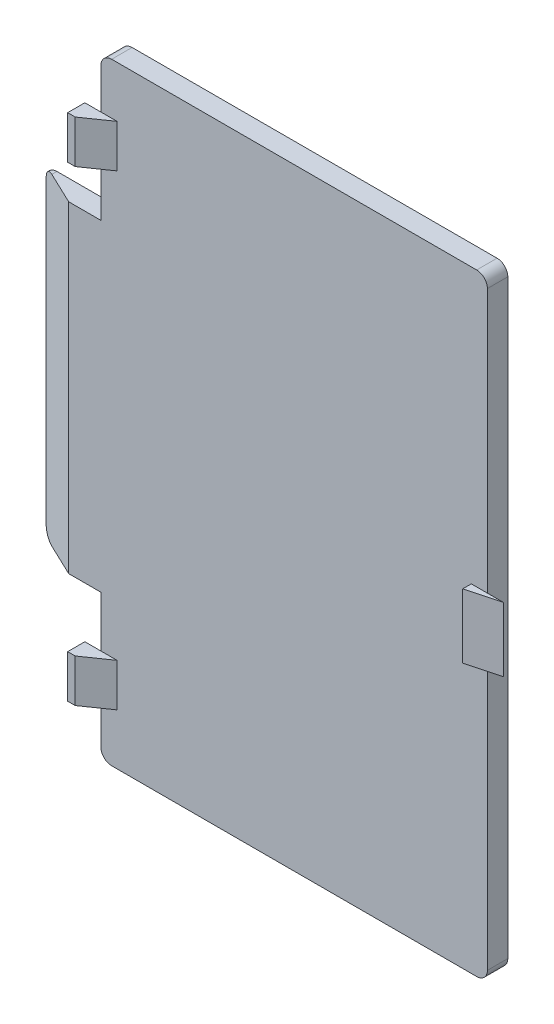
ISO-10303-21;
HEADER;
FILE_DESCRIPTION(('STEP AP214'),'2;1');
FILE_NAME('part.step','',(''),(''),'','','');
FILE_SCHEMA(('AUTOMOTIVE_DESIGN { 1 0 10303 214 1 1 1 1 }'));
ENDSEC;
DATA;
#1=APPLICATION_CONTEXT('core data for automotive mechanical design processes');
#2=APPLICATION_PROTOCOL_DEFINITION('international standard','automotive_design',2000,#1);
#3=PRODUCT_CONTEXT('',#1,'mechanical');
#4=PRODUCT('Part','Part','',(#3));
#5=PRODUCT_RELATED_PRODUCT_CATEGORY('part','',(#4));
#6=PRODUCT_DEFINITION_FORMATION('','',#4);
#7=PRODUCT_DEFINITION_CONTEXT('part definition',#1,'design');
#8=PRODUCT_DEFINITION('design','',#6,#7);
#9=PRODUCT_DEFINITION_SHAPE('','',#8);
#10=(LENGTH_UNIT() NAMED_UNIT(*) SI_UNIT(.MILLI.,.METRE.));
#11=(NAMED_UNIT(*) PLANE_ANGLE_UNIT() SI_UNIT($,.RADIAN.));
#12=(NAMED_UNIT(*) SI_UNIT($,.STERADIAN.) SOLID_ANGLE_UNIT());
#13=UNCERTAINTY_MEASURE_WITH_UNIT(LENGTH_MEASURE(1.E-05),#10,'distance_accuracy_value','');
#14=(GEOMETRIC_REPRESENTATION_CONTEXT(3) GLOBAL_UNCERTAINTY_ASSIGNED_CONTEXT((#13)) GLOBAL_UNIT_ASSIGNED_CONTEXT((#10,
#11,#12)) REPRESENTATION_CONTEXT('',''));
#15=CARTESIAN_POINT('',(0.,0.,0.));
#16=DIRECTION('',(0.,0.,1.));
#17=DIRECTION('',(1.,0.,0.));
#18=AXIS2_PLACEMENT_3D('',#15,#16,#17);
#19=CARTESIAN_POINT('',(20.6987465116818,-11.3905392874902,1.9));
#20=DIRECTION('',(0.,-1.,0.));
#21=DIRECTION('',(1.,0.,0.));
#22=AXIS2_PLACEMENT_3D('',#19,#20,#21);
#23=PLANE('',#22);
#24=DIRECTION('',(-0.966234939601229,0.,0.257662650560397));
#25=VECTOR('',#24,1.);
#26=CARTESIAN_POINT('',(20.6987465116818,-11.3905392874902,1.90000000000026));
#27=LINE('',#26,#25);
#28=CARTESIAN_POINT('',(20.6987465116818,-11.3905392874902,1.90000000000028));
#29=VERTEX_POINT('',#28);
#30=CARTESIAN_POINT('',(17.6987465116818,-11.3905392874902,2.7));
#31=VERTEX_POINT('',#30);
#32=EDGE_CURVE('E581',#29,#31,#27,.T.);
#33=ORIENTED_EDGE('',*,*,#32,.F.);
#34=DIRECTION('',(-1.,0.,0.));
#35=VECTOR('',#34,1.);
#36=CARTESIAN_POINT('',(20.6987465116818,-11.3905392874902,1.9));
#37=LINE('',#36,#35);
#38=CARTESIAN_POINT('',(19.1987465116818,-11.3905392874902,1.9));
#39=VERTEX_POINT('',#38);
#40=EDGE_CURVE('E598',#29,#39,#37,.T.);
#41=ORIENTED_EDGE('',*,*,#40,.T.);
#42=CARTESIAN_POINT('',(17.6987465116818,-11.3905392874902,1.9));
#43=VERTEX_POINT('',#42);
#44=EDGE_CURVE('E499',#39,#43,#37,.T.);
#45=ORIENTED_EDGE('',*,*,#44,.T.);
#46=DIRECTION('',(0.,0.,1.));
#47=VECTOR('',#46,1.);
#48=CARTESIAN_POINT('',(17.6987465116818,-11.3905392874902,1.9));
#49=LINE('',#48,#47);
#50=EDGE_CURVE('E584',#43,#31,#49,.T.);
#51=ORIENTED_EDGE('',*,*,#50,.T.);
#52=EDGE_LOOP('',(#33,#41,#45,#51));
#53=FACE_BOUND('',#52,.T.);
#54=ADVANCED_FACE('F45',(#53),#23,.F.);
#55=CARTESIAN_POINT('',(20.6987465116818,-17.3905392874902,1.9));
#56=DIRECTION('',(0.,1.,0.));
#57=DIRECTION('',(0.,0.,1.));
#58=AXIS2_PLACEMENT_3D('',#55,#56,#57);
#59=PLANE('',#58);
#60=DIRECTION('',(-0.966234939601229,0.,0.257662650560397));
#61=VECTOR('',#60,1.);
#62=CARTESIAN_POINT('',(20.6987465116818,-17.3905392874901,1.9));
#63=LINE('',#62,#61);
#64=CARTESIAN_POINT('',(20.6987465116818,-17.3905392874901,1.9));
#65=VERTEX_POINT('',#64);
#66=CARTESIAN_POINT('',(17.6987465116818,-17.3905392874901,2.70000000000021));
#67=VERTEX_POINT('',#66);
#68=EDGE_CURVE('E577',#65,#67,#63,.T.);
#69=ORIENTED_EDGE('',*,*,#68,.T.);
#70=DIRECTION('',(0.,0.,-1.));
#71=VECTOR('',#70,1.);
#72=CARTESIAN_POINT('',(17.6987465116818,-17.3905392874902,1.9));
#73=LINE('',#72,#71);
#74=CARTESIAN_POINT('',(17.6987465116818,-17.3905392874902,1.9));
#75=VERTEX_POINT('',#74);
#76=EDGE_CURVE('E594',#67,#75,#73,.T.);
#77=ORIENTED_EDGE('',*,*,#76,.T.);
#78=DIRECTION('',(-1.,0.,0.));
#79=VECTOR('',#78,1.);
#80=CARTESIAN_POINT('',(20.6987465116818,-17.3905392874902,1.9));
#81=LINE('',#80,#79);
#82=CARTESIAN_POINT('',(19.1987465116818,-17.3905392874902,1.9));
#83=VERTEX_POINT('',#82);
#84=EDGE_CURVE('E64',#83,#75,#81,.T.);
#85=ORIENTED_EDGE('',*,*,#84,.F.);
#86=EDGE_CURVE('E536',#65,#83,#81,.T.);
#87=ORIENTED_EDGE('',*,*,#86,.F.);
#88=EDGE_LOOP('',(#69,#77,#85,#87));
#89=FACE_BOUND('',#88,.T.);
#90=ADVANCED_FACE('F613',(#89),#59,.F.);
#91=CARTESIAN_POINT('',(-22.8012534883182,-0.318157770285112,1.9));
#92=DIRECTION('',(0.,0.,-1.));
#93=DIRECTION('',(-1.,0.,0.));
#94=AXIS2_PLACEMENT_3D('',#91,#92,#93);
#95=PLANE('',#94);
#96=DIRECTION('',(1.,0.,0.));
#97=VECTOR('',#96,1.);
#98=CARTESIAN_POINT('',(-18.3012534883182,-34.0581577702851,1.9));
#99=LINE('',#98,#97);
#100=CARTESIAN_POINT('',(-16.8012534883182,-34.0581577702851,1.9));
#101=VERTEX_POINT('',#100);
#102=CARTESIAN_POINT('',(-15.3012534883182,-34.0581577702851,1.9));
#103=VERTEX_POINT('',#102);
#104=EDGE_CURVE('E55',#101,#103,#99,.T.);
#105=ORIENTED_EDGE('',*,*,#104,.T.);
#106=DIRECTION('',(0.,-1.,0.));
#107=VECTOR('',#106,1.);
#108=CARTESIAN_POINT('',(-15.3012534883182,-35.5681577702851,1.9));
#109=LINE('',#108,#107);
#110=CARTESIAN_POINT('',(-15.3012534883182,-38.0581577702851,1.9));
#111=VERTEX_POINT('',#110);
#112=EDGE_CURVE('E245',#103,#111,#109,.T.);
#113=ORIENTED_EDGE('',*,*,#112,.T.);
#114=DIRECTION('',(1.,0.,0.));
#115=VECTOR('',#114,1.);
#116=CARTESIAN_POINT('',(-18.3012534883182,-38.0581577702851,1.9));
#117=LINE('',#116,#115);
#118=CARTESIAN_POINT('',(-16.8012534883182,-38.0581577702851,1.9));
#119=VERTEX_POINT('',#118);
#120=EDGE_CURVE('E11',#119,#111,#117,.T.);
#121=ORIENTED_EDGE('',*,*,#120,.F.);
#122=DIRECTION('',(0.,-1.,0.));
#123=VECTOR('',#122,1.);
#124=CARTESIAN_POINT('',(-16.8012534883182,-29.3181577702851,1.9));
#125=LINE('',#124,#123);
#126=CARTESIAN_POINT('',(-16.8012534883182,-41.8181577702851,1.9));
#127=VERTEX_POINT('',#126);
#128=EDGE_CURVE('E323',#119,#127,#125,.T.);
#129=ORIENTED_EDGE('',*,*,#128,.T.);
#130=CARTESIAN_POINT('',(-15.8012534883182,-41.8181577702851,1.9));
#131=DIRECTION('',(0.,0.,1.));
#132=DIRECTION('',(1.,0.,0.));
#133=AXIS2_PLACEMENT_3D('',#130,#131,#132);
#134=CIRCLE('',#133,1.);
#135=CARTESIAN_POINT('',(-15.8012534883182,-42.8181577702851,1.9));
#136=VERTEX_POINT('',#135);
#137=EDGE_CURVE('E329',#127,#136,#134,.T.);
#138=ORIENTED_EDGE('',*,*,#137,.T.);
#139=DIRECTION('',(1.,0.,0.));
#140=VECTOR('',#139,1.);
#141=CARTESIAN_POINT('',(-15.8012534883182,-42.8181577702851,1.9));
#142=LINE('',#141,#140);
#143=CARTESIAN_POINT('',(18.1987465116818,-42.8181577702851,1.9));
#144=VERTEX_POINT('',#143);
#145=EDGE_CURVE('E333',#136,#144,#142,.T.);
#146=ORIENTED_EDGE('',*,*,#145,.T.);
#147=CARTESIAN_POINT('',(18.1987465116818,-41.8181577702851,1.9));
#148=DIRECTION('',(0.,0.,1.));
#149=DIRECTION('',(1.,0.,0.));
#150=AXIS2_PLACEMENT_3D('',#147,#148,#149);
#151=CIRCLE('',#150,1.);
#152=CARTESIAN_POINT('',(19.1987465116818,-41.8181577702851,1.9));
#153=VERTEX_POINT('',#152);
#154=EDGE_CURVE('E336',#144,#153,#151,.T.);
#155=ORIENTED_EDGE('',*,*,#154,.T.);
#156=DIRECTION('',(0.,1.,0.));
#157=VECTOR('',#156,1.);
#158=CARTESIAN_POINT('',(19.1987465116818,13.1818422297149,1.9));
#159=LINE('',#158,#157);
#160=EDGE_CURVE('E340',#153,#83,#159,.T.);
#161=ORIENTED_EDGE('',*,*,#160,.T.);
#162=ORIENTED_EDGE('',*,*,#84,.T.);
#163=DIRECTION('',(0.,1.,0.));
#164=VECTOR('',#163,1.);
#165=CARTESIAN_POINT('',(17.6987465116818,-11.3905392874902,1.9));
#166=LINE('',#165,#164);
#167=EDGE_CURVE('E69',#75,#43,#166,.T.);
#168=ORIENTED_EDGE('',*,*,#167,.T.);
#169=ORIENTED_EDGE('',*,*,#44,.F.);
#170=CARTESIAN_POINT('',(19.1987465116818,13.1818422297149,1.9));
#171=VERTEX_POINT('',#170);
#172=EDGE_CURVE('E339',#39,#171,#159,.T.);
#173=ORIENTED_EDGE('',*,*,#172,.T.);
#174=CARTESIAN_POINT('',(18.1987465116818,13.1818422297149,1.9));
#175=DIRECTION('',(0.,0.,1.));
#176=DIRECTION('',(-1.,0.,0.));
#177=AXIS2_PLACEMENT_3D('',#174,#175,#176);
#178=CIRCLE('',#177,1.);
#179=CARTESIAN_POINT('',(18.1987465116818,14.1818422297149,1.9));
#180=VERTEX_POINT('',#179);
#181=EDGE_CURVE('E343',#171,#180,#178,.T.);
#182=ORIENTED_EDGE('',*,*,#181,.T.);
#183=DIRECTION('',(-1.,0.,0.));
#184=VECTOR('',#183,1.);
#185=CARTESIAN_POINT('',(-15.8012534883182,14.1818422297149,1.9));
#186=LINE('',#185,#184);
#187=CARTESIAN_POINT('',(-15.8012534883182,14.1818422297149,1.9));
#188=VERTEX_POINT('',#187);
#189=EDGE_CURVE('E347',#180,#188,#186,.T.);
#190=ORIENTED_EDGE('',*,*,#189,.T.);
#191=CARTESIAN_POINT('',(-15.8012534883182,13.1818422297149,1.9));
#192=DIRECTION('',(0.,0.,1.));
#193=DIRECTION('',(1.,0.,0.));
#194=AXIS2_PLACEMENT_3D('',#191,#192,#193);
#195=CIRCLE('',#194,1.);
#196=CARTESIAN_POINT('',(-16.8012534883182,13.1818422297149,1.9));
#197=VERTEX_POINT('',#196);
#198=EDGE_CURVE('E350',#188,#197,#195,.T.);
#199=ORIENTED_EDGE('',*,*,#198,.T.);
#200=DIRECTION('',(0.,-1.,0.));
#201=VECTOR('',#200,1.);
#202=CARTESIAN_POINT('',(-16.8012534883182,13.1818422297149,1.9));
#203=LINE('',#202,#201);
#204=CARTESIAN_POINT('',(-16.8012534883182,9.42184222971489,1.9));
#205=VERTEX_POINT('',#204);
#206=EDGE_CURVE('E265',#197,#205,#203,.T.);
#207=ORIENTED_EDGE('',*,*,#206,.T.);
#208=DIRECTION('',(1.,0.,0.));
#209=VECTOR('',#208,1.);
#210=CARTESIAN_POINT('',(-18.3012534883182,9.42184222971489,1.9));
#211=LINE('',#210,#209);
#212=CARTESIAN_POINT('',(-15.3012534883182,9.42184222971489,1.9));
#213=VERTEX_POINT('',#212);
#214=EDGE_CURVE('E253',#205,#213,#211,.T.);
#215=ORIENTED_EDGE('',*,*,#214,.T.);
#216=DIRECTION('',(0.,-1.,0.));
#217=VECTOR('',#216,1.);
#218=CARTESIAN_POINT('',(-15.3012534883182,6.93184222971489,1.9));
#219=LINE('',#218,#217);
#220=CARTESIAN_POINT('',(-15.3012534883182,5.42184222971489,1.9));
#221=VERTEX_POINT('',#220);
#222=EDGE_CURVE('E234',#213,#221,#219,.T.);
#223=ORIENTED_EDGE('',*,*,#222,.T.);
#224=DIRECTION('',(1.,0.,0.));
#225=VECTOR('',#224,1.);
#226=CARTESIAN_POINT('',(-18.3012534883182,5.42184222971489,1.9));
#227=LINE('',#226,#225);
#228=CARTESIAN_POINT('',(-16.8012534883182,5.42184222971489,1.9));
#229=VERTEX_POINT('',#228);
#230=EDGE_CURVE('E525',#229,#221,#227,.T.);
#231=ORIENTED_EDGE('',*,*,#230,.F.);
#232=CARTESIAN_POINT('',(-16.8012534883182,0.681842229714891,1.9));
#233=VERTEX_POINT('',#232);
#234=EDGE_CURVE('E353',#229,#233,#203,.T.);
#235=ORIENTED_EDGE('',*,*,#234,.T.);
#236=DIRECTION('',(-1.,0.,0.));
#237=VECTOR('',#236,1.);
#238=CARTESIAN_POINT('',(-22.8012534883182,0.681842229714889,1.9));
#239=LINE('',#238,#237);
#240=CARTESIAN_POINT('',(-19.8012534883182,0.68184222971489,1.9));
#241=VERTEX_POINT('',#240);
#242=EDGE_CURVE('E356',#233,#241,#239,.T.);
#243=ORIENTED_EDGE('',*,*,#242,.T.);
#244=DIRECTION('',(0.,1.,0.));
#245=VECTOR('',#244,1.);
#246=CARTESIAN_POINT('',(-19.8012534883182,-99.3181577702851,1.9));
#247=LINE('',#246,#245);
#248=CARTESIAN_POINT('',(-19.8012534883182,-29.3181577702851,1.9));
#249=VERTEX_POINT('',#248);
#250=EDGE_CURVE('E535',#249,#241,#247,.T.);
#251=ORIENTED_EDGE('',*,*,#250,.F.);
#252=DIRECTION('',(1.,0.,0.));
#253=VECTOR('',#252,1.);
#254=CARTESIAN_POINT('',(-22.8012534883182,-29.3181577702851,1.9));
#255=LINE('',#254,#253);
#256=CARTESIAN_POINT('',(-16.8012534883182,-29.3181577702851,1.9));
#257=VERTEX_POINT('',#256);
#258=EDGE_CURVE('E320',#249,#257,#255,.T.);
#259=ORIENTED_EDGE('',*,*,#258,.T.);
#260=EDGE_CURVE('E325',#257,#101,#125,.T.);
#261=ORIENTED_EDGE('',*,*,#260,.T.);
#262=EDGE_LOOP('',(#105,#113,#121,#129,#138,#146,#155,#161,#162,#168,#169,#173,#182,#190,#199,
#207,#215,#223,#231,#235,#243,#251,#259,#261));
#263=FACE_BOUND('',#262,.T.);
#264=ADVANCED_FACE('F263',(#263),#95,.F.);
#265=CARTESIAN_POINT('',(-22.8012534883182,-0.318157770285112,1.9));
#266=DIRECTION('',(0.,0.,-1.));
#267=DIRECTION('',(-1.,0.,0.));
#268=AXIS2_PLACEMENT_3D('',#265,#266,#267);
#269=CYLINDRICAL_SURFACE('',#268,1.);
#270=CARTESIAN_POINT('',(-22.8012534883182,-0.318157770285112,0.));
#271=DIRECTION('',(0.,0.,1.));
#272=DIRECTION('',(-1.,0.,0.));
#273=AXIS2_PLACEMENT_3D('',#270,#271,#272);
#274=CIRCLE('',#273,1.);
#275=CARTESIAN_POINT('',(-22.8012534883182,0.681842229714889,0.));
#276=VERTEX_POINT('',#275);
#277=CARTESIAN_POINT('',(-23.8012534883182,-0.318157770285119,0.));
#278=VERTEX_POINT('',#277);
#279=EDGE_CURVE('E319',#276,#278,#274,.T.);
#280=ORIENTED_EDGE('',*,*,#279,.T.);
#281=CARTESIAN_POINT('',(-22.8012534883182,-0.318157770285112,0.475));
#282=DIRECTION('',(0.429056814568287,0.,-0.90327750435429));
#283=DIRECTION('',(-0.90327750435429,0.,-0.429056814568287));
#284=AXIS2_PLACEMENT_3D('',#281,#282,#283);
#285=ELLIPSE('',#284,1.10707949127423,1.);
#286=CARTESIAN_POINT('',(-22.8012534883182,0.681842229714889,0.475000000000003));
#287=VERTEX_POINT('',#286);
#288=EDGE_CURVE('E551',#278,#287,#285,.T.);
#289=ORIENTED_EDGE('',*,*,#288,.T.);
#290=DIRECTION('',(0.,0.,-1.));
#291=VECTOR('',#290,1.);
#292=CARTESIAN_POINT('',(-22.8012534883182,0.681842229714889,1.9));
#293=LINE('',#292,#291);
#294=EDGE_CURVE('E361',#287,#276,#293,.T.);
#295=ORIENTED_EDGE('',*,*,#294,.T.);
#296=EDGE_LOOP('',(#280,#289,#295));
#297=FACE_BOUND('',#296,.T.);
#298=ADVANCED_FACE('F47',(#297),#269,.T.);
#299=CARTESIAN_POINT('',(-22.8012534883182,-28.3181577702851,1.9));
#300=DIRECTION('',(0.,0.,-1.));
#301=DIRECTION('',(-1.,0.,0.));
#302=AXIS2_PLACEMENT_3D('',#299,#300,#301);
#303=CYLINDRICAL_SURFACE('',#302,1.);
#304=DIRECTION('',(0.,0.,-1.));
#305=VECTOR('',#304,1.);
#306=CARTESIAN_POINT('',(-22.8012534883182,-29.3181577702851,1.9));
#307=LINE('',#306,#305);
#308=CARTESIAN_POINT('',(-22.8012534883182,-29.3181577702851,0.474999999999997));
#309=VERTEX_POINT('',#308);
#310=CARTESIAN_POINT('',(-22.8012534883182,-29.3181577702851,0.));
#311=VERTEX_POINT('',#310);
#312=EDGE_CURVE('E49',#309,#311,#307,.T.);
#313=ORIENTED_EDGE('',*,*,#312,.F.);
#314=CARTESIAN_POINT('',(-22.8012534883182,-28.3181577702851,0.474999999999995));
#315=DIRECTION('',(0.429056814568287,0.,-0.90327750435429));
#316=DIRECTION('',(-0.90327750435429,0.,-0.429056814568287));
#317=AXIS2_PLACEMENT_3D('',#314,#315,#316);
#318=ELLIPSE('',#317,1.10707949127423,1.);
#319=CARTESIAN_POINT('',(-23.8012534883182,-28.3181577702851,0.));
#320=VERTEX_POINT('',#319);
#321=EDGE_CURVE('E547',#309,#320,#318,.T.);
#322=ORIENTED_EDGE('',*,*,#321,.T.);
#323=CARTESIAN_POINT('',(-22.8012534883182,-28.3181577702851,0.));
#324=DIRECTION('',(0.,0.,1.));
#325=DIRECTION('',(1.,0.,0.));
#326=AXIS2_PLACEMENT_3D('',#323,#324,#325);
#327=CIRCLE('',#326,1.);
#328=EDGE_CURVE('E368',#320,#311,#327,.T.);
#329=ORIENTED_EDGE('',*,*,#328,.T.);
#330=EDGE_LOOP('',(#313,#322,#329));
#331=FACE_BOUND('',#330,.T.);
#332=ADVANCED_FACE('F689',(#331),#303,.T.);
#333=CARTESIAN_POINT('',(-22.8012534883182,-29.3181577702851,1.9));
#334=DIRECTION('',(0.,1.,0.));
#335=DIRECTION('',(0.,0.,1.));
#336=AXIS2_PLACEMENT_3D('',#333,#334,#335);
#337=PLANE('',#336);
#338=ORIENTED_EDGE('',*,*,#258,.F.);
#339=DIRECTION('',(-0.90327750435429,0.,-0.429056814568288));
#340=VECTOR('',#339,1.);
#341=CARTESIAN_POINT('',(-22.2489842379358,-29.3181577702851,0.737327893931666));
#342=LINE('',#341,#340);
#343=EDGE_CURVE('E540',#249,#309,#342,.T.);
#344=ORIENTED_EDGE('',*,*,#343,.T.);
#345=ORIENTED_EDGE('',*,*,#312,.T.);
#346=DIRECTION('',(1.,0.,0.));
#347=VECTOR('',#346,1.);
#348=CARTESIAN_POINT('',(-22.8012534883182,-29.3181577702851,0.));
#349=LINE('',#348,#347);
#350=CARTESIAN_POINT('',(-16.8012534883182,-29.3181577702851,0.));
#351=VERTEX_POINT('',#350);
#352=EDGE_CURVE('E372',#311,#351,#349,.T.);
#353=ORIENTED_EDGE('',*,*,#352,.T.);
#354=DIRECTION('',(0.,0.,-1.));
#355=VECTOR('',#354,1.);
#356=CARTESIAN_POINT('',(-16.8012534883182,-29.3181577702851,1.9));
#357=LINE('',#356,#355);
#358=EDGE_CURVE('E442',#257,#351,#357,.T.);
#359=ORIENTED_EDGE('',*,*,#358,.F.);
#360=EDGE_LOOP('',(#338,#344,#345,#353,#359));
#361=FACE_BOUND('',#360,.T.);
#362=ADVANCED_FACE('F687',(#361),#337,.F.);
#363=CARTESIAN_POINT('',(-16.8012534883182,-29.3181577702851,1.9));
#364=DIRECTION('',(1.,0.,0.));
#365=DIRECTION('',(0.,1.,0.));
#366=AXIS2_PLACEMENT_3D('',#363,#364,#365);
#367=PLANE('',#366);
#368=DIRECTION('',(0.,-1.,0.));
#369=VECTOR('',#368,1.);
#370=CARTESIAN_POINT('',(-16.8012534883182,-29.3181577702851,0.));
#371=LINE('',#370,#369);
#372=CARTESIAN_POINT('',(-16.8012534883182,-41.8181577702851,0.));
#373=VERTEX_POINT('',#372);
#374=EDGE_CURVE('E375',#351,#373,#371,.T.);
#375=ORIENTED_EDGE('',*,*,#374,.T.);
#376=DIRECTION('',(0.,0.,-1.));
#377=VECTOR('',#376,1.);
#378=CARTESIAN_POINT('',(-16.8012534883182,-41.8181577702851,1.9));
#379=LINE('',#378,#377);
#380=EDGE_CURVE('E439',#127,#373,#379,.T.);
#381=ORIENTED_EDGE('',*,*,#380,.F.);
#382=ORIENTED_EDGE('',*,*,#128,.F.);
#383=EDGE_CURVE('E330',#101,#119,#125,.T.);
#384=ORIENTED_EDGE('',*,*,#383,.F.);
#385=ORIENTED_EDGE('',*,*,#260,.F.);
#386=ORIENTED_EDGE('',*,*,#358,.T.);
#387=EDGE_LOOP('',(#375,#381,#382,#384,#385,#386));
#388=FACE_BOUND('',#387,.T.);
#389=ADVANCED_FACE('F466',(#388),#367,.F.);
#390=CARTESIAN_POINT('',(-15.8012534883182,-41.8181577702851,1.9));
#391=DIRECTION('',(0.,0.,-1.));
#392=DIRECTION('',(-1.,0.,0.));
#393=AXIS2_PLACEMENT_3D('',#390,#391,#392);
#394=CYLINDRICAL_SURFACE('',#393,1.);
#395=CARTESIAN_POINT('',(-15.8012534883182,-41.8181577702851,0.));
#396=DIRECTION('',(0.,0.,1.));
#397=DIRECTION('',(1.,0.,0.));
#398=AXIS2_PLACEMENT_3D('',#395,#396,#397);
#399=CIRCLE('',#398,1.);
#400=CARTESIAN_POINT('',(-15.8012534883182,-42.8181577702851,0.));
#401=VERTEX_POINT('',#400);
#402=EDGE_CURVE('E378',#373,#401,#399,.T.);
#403=ORIENTED_EDGE('',*,*,#402,.T.);
#404=DIRECTION('',(0.,0.,-1.));
#405=VECTOR('',#404,1.);
#406=CARTESIAN_POINT('',(-15.8012534883182,-42.8181577702851,1.9));
#407=LINE('',#406,#405);
#408=EDGE_CURVE('E435',#136,#401,#407,.T.);
#409=ORIENTED_EDGE('',*,*,#408,.F.);
#410=ORIENTED_EDGE('',*,*,#137,.F.);
#411=ORIENTED_EDGE('',*,*,#380,.T.);
#412=EDGE_LOOP('',(#403,#409,#410,#411));
#413=FACE_BOUND('',#412,.T.);
#414=ADVANCED_FACE('F474',(#413),#394,.T.);
#415=CARTESIAN_POINT('',(-15.8012534883182,-42.8181577702851,1.9));
#416=DIRECTION('',(0.,1.,0.));
#417=DIRECTION('',(-1.,0.,0.));
#418=AXIS2_PLACEMENT_3D('',#415,#416,#417);
#419=PLANE('',#418);
#420=DIRECTION('',(1.,0.,0.));
#421=VECTOR('',#420,1.);
#422=CARTESIAN_POINT('',(-15.8012534883182,-42.8181577702851,0.));
#423=LINE('',#422,#421);
#424=CARTESIAN_POINT('',(18.1987465116818,-42.8181577702851,0.));
#425=VERTEX_POINT('',#424);
#426=EDGE_CURVE('E381',#401,#425,#423,.T.);
#427=ORIENTED_EDGE('',*,*,#426,.T.);
#428=DIRECTION('',(0.,0.,-1.));
#429=VECTOR('',#428,1.);
#430=CARTESIAN_POINT('',(18.1987465116818,-42.8181577702851,1.9));
#431=LINE('',#430,#429);
#432=EDGE_CURVE('E431',#144,#425,#431,.T.);
#433=ORIENTED_EDGE('',*,*,#432,.F.);
#434=ORIENTED_EDGE('',*,*,#145,.F.);
#435=ORIENTED_EDGE('',*,*,#408,.T.);
#436=EDGE_LOOP('',(#427,#433,#434,#435));
#437=FACE_BOUND('',#436,.T.);
#438=ADVANCED_FACE('F479',(#437),#419,.F.);
#439=CARTESIAN_POINT('',(18.1987465116818,-41.8181577702851,1.9));
#440=DIRECTION('',(0.,0.,-1.));
#441=DIRECTION('',(-1.,0.,0.));
#442=AXIS2_PLACEMENT_3D('',#439,#440,#441);
#443=CYLINDRICAL_SURFACE('',#442,1.);
#444=CARTESIAN_POINT('',(18.1987465116818,-41.8181577702851,0.));
#445=DIRECTION('',(0.,0.,1.));
#446=DIRECTION('',(1.,0.,0.));
#447=AXIS2_PLACEMENT_3D('',#444,#445,#446);
#448=CIRCLE('',#447,1.);
#449=CARTESIAN_POINT('',(19.1987465116818,-41.8181577702851,0.));
#450=VERTEX_POINT('',#449);
#451=EDGE_CURVE('E384',#425,#450,#448,.T.);
#452=ORIENTED_EDGE('',*,*,#451,.T.);
#453=DIRECTION('',(0.,0.,-1.));
#454=VECTOR('',#453,1.);
#455=CARTESIAN_POINT('',(19.1987465116818,-41.8181577702851,1.9));
#456=LINE('',#455,#454);
#457=EDGE_CURVE('E427',#153,#450,#456,.T.);
#458=ORIENTED_EDGE('',*,*,#457,.F.);
#459=ORIENTED_EDGE('',*,*,#154,.F.);
#460=ORIENTED_EDGE('',*,*,#432,.T.);
#461=EDGE_LOOP('',(#452,#458,#459,#460));
#462=FACE_BOUND('',#461,.T.);
#463=ADVANCED_FACE('F484',(#462),#443,.T.);
#464=CARTESIAN_POINT('',(19.1987465116818,13.1818422297149,1.9));
#465=DIRECTION('',(-1.,0.,0.));
#466=DIRECTION('',(0.,-1.,0.));
#467=AXIS2_PLACEMENT_3D('',#464,#465,#466);
#468=PLANE('',#467);
#469=DIRECTION('',(0.,1.,0.));
#470=VECTOR('',#469,1.);
#471=CARTESIAN_POINT('',(19.1987465116818,13.1818422297149,0.));
#472=LINE('',#471,#470);
#473=CARTESIAN_POINT('',(19.1987465116818,13.1818422297149,0.));
#474=VERTEX_POINT('',#473);
#475=EDGE_CURVE('E387',#450,#474,#472,.T.);
#476=ORIENTED_EDGE('',*,*,#475,.T.);
#477=DIRECTION('',(0.,0.,-1.));
#478=VECTOR('',#477,1.);
#479=CARTESIAN_POINT('',(19.1987465116818,13.1818422297149,1.9));
#480=LINE('',#479,#478);
#481=EDGE_CURVE('E423',#171,#474,#480,.T.);
#482=ORIENTED_EDGE('',*,*,#481,.F.);
#483=ORIENTED_EDGE('',*,*,#172,.F.);
#484=EDGE_CURVE('E344',#83,#39,#159,.T.);
#485=ORIENTED_EDGE('',*,*,#484,.F.);
#486=ORIENTED_EDGE('',*,*,#160,.F.);
#487=ORIENTED_EDGE('',*,*,#457,.T.);
#488=EDGE_LOOP('',(#476,#482,#483,#485,#486,#487));
#489=FACE_BOUND('',#488,.T.);
#490=ADVANCED_FACE('F488',(#489),#468,.F.);
#491=CARTESIAN_POINT('',(18.1987465116818,13.1818422297149,1.9));
#492=DIRECTION('',(0.,0.,-1.));
#493=DIRECTION('',(-1.,0.,0.));
#494=AXIS2_PLACEMENT_3D('',#491,#492,#493);
#495=CYLINDRICAL_SURFACE('',#494,1.);
#496=CARTESIAN_POINT('',(18.1987465116818,13.1818422297149,0.));
#497=DIRECTION('',(0.,0.,1.));
#498=DIRECTION('',(-1.,0.,0.));
#499=AXIS2_PLACEMENT_3D('',#496,#497,#498);
#500=CIRCLE('',#499,1.);
#501=CARTESIAN_POINT('',(18.1987465116818,14.1818422297149,0.));
#502=VERTEX_POINT('',#501);
#503=EDGE_CURVE('E390',#474,#502,#500,.T.);
#504=ORIENTED_EDGE('',*,*,#503,.T.);
#505=DIRECTION('',(0.,0.,-1.));
#506=VECTOR('',#505,1.);
#507=CARTESIAN_POINT('',(18.1987465116818,14.1818422297149,1.9));
#508=LINE('',#507,#506);
#509=EDGE_CURVE('E419',#180,#502,#508,.T.);
#510=ORIENTED_EDGE('',*,*,#509,.F.);
#511=ORIENTED_EDGE('',*,*,#181,.F.);
#512=ORIENTED_EDGE('',*,*,#481,.T.);
#513=EDGE_LOOP('',(#504,#510,#511,#512));
#514=FACE_BOUND('',#513,.T.);
#515=ADVANCED_FACE('F502',(#514),#495,.T.);
#516=CARTESIAN_POINT('',(-15.8012534883182,14.1818422297149,1.9));
#517=DIRECTION('',(0.,-1.,0.));
#518=DIRECTION('',(0.,0.,-1.));
#519=AXIS2_PLACEMENT_3D('',#516,#517,#518);
#520=PLANE('',#519);
#521=DIRECTION('',(-1.,0.,0.));
#522=VECTOR('',#521,1.);
#523=CARTESIAN_POINT('',(-15.8012534883182,14.1818422297149,0.));
#524=LINE('',#523,#522);
#525=CARTESIAN_POINT('',(-15.8012534883182,14.1818422297149,0.));
#526=VERTEX_POINT('',#525);
#527=EDGE_CURVE('E393',#502,#526,#524,.T.);
#528=ORIENTED_EDGE('',*,*,#527,.T.);
#529=DIRECTION('',(0.,0.,-1.));
#530=VECTOR('',#529,1.);
#531=CARTESIAN_POINT('',(-15.8012534883182,14.1818422297149,1.9));
#532=LINE('',#531,#530);
#533=EDGE_CURVE('E415',#188,#526,#532,.T.);
#534=ORIENTED_EDGE('',*,*,#533,.F.);
#535=ORIENTED_EDGE('',*,*,#189,.F.);
#536=ORIENTED_EDGE('',*,*,#509,.T.);
#537=EDGE_LOOP('',(#528,#534,#535,#536));
#538=FACE_BOUND('',#537,.T.);
#539=ADVANCED_FACE('F507',(#538),#520,.F.);
#540=CARTESIAN_POINT('',(-15.8012534883182,13.1818422297149,1.9));
#541=DIRECTION('',(0.,0.,-1.));
#542=DIRECTION('',(-1.,0.,0.));
#543=AXIS2_PLACEMENT_3D('',#540,#541,#542);
#544=CYLINDRICAL_SURFACE('',#543,1.);
#545=CARTESIAN_POINT('',(-15.8012534883182,13.1818422297149,0.));
#546=DIRECTION('',(0.,0.,1.));
#547=DIRECTION('',(1.,0.,0.));
#548=AXIS2_PLACEMENT_3D('',#545,#546,#547);
#549=CIRCLE('',#548,1.);
#550=CARTESIAN_POINT('',(-16.8012534883182,13.1818422297149,0.));
#551=VERTEX_POINT('',#550);
#552=EDGE_CURVE('E396',#526,#551,#549,.T.);
#553=ORIENTED_EDGE('',*,*,#552,.T.);
#554=DIRECTION('',(0.,0.,-1.));
#555=VECTOR('',#554,1.);
#556=CARTESIAN_POINT('',(-16.8012534883182,13.1818422297149,1.9));
#557=LINE('',#556,#555);
#558=EDGE_CURVE('E411',#197,#551,#557,.T.);
#559=ORIENTED_EDGE('',*,*,#558,.F.);
#560=ORIENTED_EDGE('',*,*,#198,.F.);
#561=ORIENTED_EDGE('',*,*,#533,.T.);
#562=EDGE_LOOP('',(#553,#559,#560,#561));
#563=FACE_BOUND('',#562,.T.);
#564=ADVANCED_FACE('F511',(#563),#544,.T.);
#565=CARTESIAN_POINT('',(-16.8012534883182,13.1818422297149,1.9));
#566=DIRECTION('',(1.,0.,0.));
#567=DIRECTION('',(0.,0.,-1.));
#568=AXIS2_PLACEMENT_3D('',#565,#566,#567);
#569=PLANE('',#568);
#570=DIRECTION('',(0.,-1.,0.));
#571=VECTOR('',#570,1.);
#572=CARTESIAN_POINT('',(-16.8012534883182,13.1818422297149,0.));
#573=LINE('',#572,#571);
#574=CARTESIAN_POINT('',(-16.8012534883182,0.681842229714891,0.));
#575=VERTEX_POINT('',#574);
#576=EDGE_CURVE('E399',#551,#575,#573,.T.);
#577=ORIENTED_EDGE('',*,*,#576,.T.);
#578=DIRECTION('',(0.,0.,-1.));
#579=VECTOR('',#578,1.);
#580=CARTESIAN_POINT('',(-16.8012534883182,0.681842229714891,1.9));
#581=LINE('',#580,#579);
#582=EDGE_CURVE('E407',#233,#575,#581,.T.);
#583=ORIENTED_EDGE('',*,*,#582,.F.);
#584=ORIENTED_EDGE('',*,*,#234,.F.);
#585=EDGE_CURVE('E357',#205,#229,#203,.T.);
#586=ORIENTED_EDGE('',*,*,#585,.F.);
#587=ORIENTED_EDGE('',*,*,#206,.F.);
#588=ORIENTED_EDGE('',*,*,#558,.T.);
#589=EDGE_LOOP('',(#577,#583,#584,#586,#587,#588));
#590=FACE_BOUND('',#589,.T.);
#591=ADVANCED_FACE('F515',(#590),#569,.F.);
#592=CARTESIAN_POINT('',(-22.8012534883182,0.681842229714889,1.9));
#593=DIRECTION('',(0.,-1.,0.));
#594=DIRECTION('',(1.,0.,0.));
#595=AXIS2_PLACEMENT_3D('',#592,#593,#594);
#596=PLANE('',#595);
#597=ORIENTED_EDGE('',*,*,#294,.F.);
#598=DIRECTION('',(-0.90327750435429,0.,-0.429056814568287));
#599=VECTOR('',#598,1.);
#600=CARTESIAN_POINT('',(-23.8012534883182,0.681842229714888,0.));
#601=LINE('',#600,#599);
#602=EDGE_CURVE('E531',#241,#287,#601,.T.);
#603=ORIENTED_EDGE('',*,*,#602,.F.);
#604=ORIENTED_EDGE('',*,*,#242,.F.);
#605=ORIENTED_EDGE('',*,*,#582,.T.);
#606=DIRECTION('',(-1.,0.,0.));
#607=VECTOR('',#606,1.);
#608=CARTESIAN_POINT('',(-22.8012534883182,0.681842229714889,0.));
#609=LINE('',#608,#607);
#610=EDGE_CURVE('E324',#575,#276,#609,.T.);
#611=ORIENTED_EDGE('',*,*,#610,.T.);
#612=EDGE_LOOP('',(#597,#603,#604,#605,#611));
#613=FACE_BOUND('',#612,.T.);
#614=ADVANCED_FACE('F530',(#613),#596,.F.);
#615=CARTESIAN_POINT('',(-22.8012534883182,-0.318157770285112,0.));
#616=DIRECTION('',(0.,0.,-1.));
#617=DIRECTION('',(-1.,0.,0.));
#618=AXIS2_PLACEMENT_3D('',#615,#616,#617);
#619=PLANE('',#618);
#620=ORIENTED_EDGE('',*,*,#279,.F.);
#621=ORIENTED_EDGE('',*,*,#610,.F.);
#622=ORIENTED_EDGE('',*,*,#576,.F.);
#623=ORIENTED_EDGE('',*,*,#552,.F.);
#624=ORIENTED_EDGE('',*,*,#527,.F.);
#625=ORIENTED_EDGE('',*,*,#503,.F.);
#626=ORIENTED_EDGE('',*,*,#475,.F.);
#627=ORIENTED_EDGE('',*,*,#451,.F.);
#628=ORIENTED_EDGE('',*,*,#426,.F.);
#629=ORIENTED_EDGE('',*,*,#402,.F.);
#630=ORIENTED_EDGE('',*,*,#374,.F.);
#631=ORIENTED_EDGE('',*,*,#352,.F.);
#632=ORIENTED_EDGE('',*,*,#328,.F.);
#633=DIRECTION('',(0.,-1.,0.));
#634=VECTOR('',#633,1.);
#635=CARTESIAN_POINT('',(-23.8012534883182,-0.318157770285119,0.));
#636=LINE('',#635,#634);
#637=EDGE_CURVE('E365',#278,#320,#636,.T.);
#638=ORIENTED_EDGE('',*,*,#637,.F.);
#639=EDGE_LOOP('',(#620,#621,#622,#623,#624,#625,#626,#627,#628,#629,#630,#631,#632,#638));
#640=FACE_BOUND('',#639,.T.);
#641=ADVANCED_FACE('F653',(#640),#619,.T.);
#642=CARTESIAN_POINT('',(-18.3012534883182,-35.5681577702851,1.9));
#643=DIRECTION('',(0.,0.,1.));
#644=DIRECTION('',(0.,-1.,0.));
#645=AXIS2_PLACEMENT_3D('',#642,#643,#644);
#646=PLANE('',#645);
#647=CARTESIAN_POINT('',(-18.3012534883182,-34.0581577702851,1.9));
#648=VERTEX_POINT('',#647);
#649=EDGE_CURVE('E302',#648,#101,#99,.T.);
#650=ORIENTED_EDGE('',*,*,#649,.T.);
#651=ORIENTED_EDGE('',*,*,#383,.T.);
#652=CARTESIAN_POINT('',(-18.3012534883182,-38.0581577702851,1.9));
#653=VERTEX_POINT('',#652);
#654=EDGE_CURVE('E57',#653,#119,#117,.T.);
#655=ORIENTED_EDGE('',*,*,#654,.F.);
#656=DIRECTION('',(0.,-1.,0.));
#657=VECTOR('',#656,1.);
#658=CARTESIAN_POINT('',(-18.3012534883182,-38.0581577702851,1.9));
#659=LINE('',#658,#657);
#660=EDGE_CURVE('E288',#648,#653,#659,.T.);
#661=ORIENTED_EDGE('',*,*,#660,.F.);
#662=EDGE_LOOP('',(#650,#651,#655,#661));
#663=FACE_BOUND('',#662,.T.);
#664=ADVANCED_FACE('F463',(#663),#646,.F.);
#665=CARTESIAN_POINT('',(-18.3012534883182,-38.0581577702851,3.5));
#666=DIRECTION('',(0.,1.,0.));
#667=DIRECTION('',(0.,0.,1.));
#668=AXIS2_PLACEMENT_3D('',#665,#666,#667);
#669=PLANE('',#668);
#670=ORIENTED_EDGE('',*,*,#120,.T.);
#671=DIRECTION('',(-0.820905201785482,0.,0.571064488198607));
#672=VECTOR('',#671,1.);
#673=CARTESIAN_POINT('',(-18.0729732335412,-38.0581577702851,3.82815286624206));
#674=LINE('',#673,#672);
#675=CARTESIAN_POINT('',(-17.6012534883182,-38.0581577702851,3.5));
#676=VERTEX_POINT('',#675);
#677=EDGE_CURVE('E569',#111,#676,#674,.T.);
#678=ORIENTED_EDGE('',*,*,#677,.T.);
#679=DIRECTION('',(1.,0.,0.));
#680=VECTOR('',#679,1.);
#681=CARTESIAN_POINT('',(-18.3012534883182,-38.0581577702851,3.5));
#682=LINE('',#681,#680);
#683=CARTESIAN_POINT('',(-18.3012534883182,-38.0581577702851,3.5));
#684=VERTEX_POINT('',#683);
#685=EDGE_CURVE('E313',#684,#676,#682,.T.);
#686=ORIENTED_EDGE('',*,*,#685,.F.);
#687=DIRECTION('',(0.,0.,1.));
#688=VECTOR('',#687,1.);
#689=CARTESIAN_POINT('',(-18.3012534883182,-38.0581577702851,3.5));
#690=LINE('',#689,#688);
#691=EDGE_CURVE('E292',#653,#684,#690,.T.);
#692=ORIENTED_EDGE('',*,*,#691,.F.);
#693=ORIENTED_EDGE('',*,*,#654,.T.);
#694=EDGE_LOOP('',(#670,#678,#686,#692,#693));
#695=FACE_BOUND('',#694,.T.);
#696=ADVANCED_FACE('F652',(#695),#669,.F.);
#697=CARTESIAN_POINT('',(-18.3012534883182,-34.0581577702851,3.5));
#698=DIRECTION('',(0.,0.,-1.));
#699=DIRECTION('',(0.,1.,0.));
#700=AXIS2_PLACEMENT_3D('',#697,#698,#699);
#701=PLANE('',#700);
#702=ORIENTED_EDGE('',*,*,#685,.T.);
#703=DIRECTION('',(0.,1.,0.));
#704=VECTOR('',#703,1.);
#705=CARTESIAN_POINT('',(-17.6012534883182,-990.578157770285,3.5));
#706=LINE('',#705,#704);
#707=CARTESIAN_POINT('',(-17.6012534883182,-34.0581577702851,3.5));
#708=VERTEX_POINT('',#707);
#709=EDGE_CURVE('E565',#676,#708,#706,.T.);
#710=ORIENTED_EDGE('',*,*,#709,.T.);
#711=DIRECTION('',(1.,0.,0.));
#712=VECTOR('',#711,1.);
#713=CARTESIAN_POINT('',(-18.3012534883182,-34.0581577702851,3.5));
#714=LINE('',#713,#712);
#715=CARTESIAN_POINT('',(-18.3012534883182,-34.0581577702851,3.5));
#716=VERTEX_POINT('',#715);
#717=EDGE_CURVE('E309',#716,#708,#714,.T.);
#718=ORIENTED_EDGE('',*,*,#717,.F.);
#719=DIRECTION('',(0.,1.,0.));
#720=VECTOR('',#719,1.);
#721=CARTESIAN_POINT('',(-18.3012534883182,-34.0581577702851,3.5));
#722=LINE('',#721,#720);
#723=EDGE_CURVE('E295',#684,#716,#722,.T.);
#724=ORIENTED_EDGE('',*,*,#723,.F.);
#725=EDGE_LOOP('',(#702,#710,#718,#724));
#726=FACE_BOUND('',#725,.T.);
#727=ADVANCED_FACE('F656',(#726),#701,.F.);
#728=CARTESIAN_POINT('',(-18.3012534883182,-34.0581577702851,1.9));
#729=DIRECTION('',(0.,-1.,0.));
#730=DIRECTION('',(0.,0.,-1.));
#731=AXIS2_PLACEMENT_3D('',#728,#729,#730);
#732=PLANE('',#731);
#733=ORIENTED_EDGE('',*,*,#717,.T.);
#734=DIRECTION('',(0.820905201785482,0.,-0.571064488198607));
#735=VECTOR('',#734,1.);
#736=CARTESIAN_POINT('',(-17.3229095392736,-34.0581577702851,3.3063694267516));
#737=LINE('',#736,#735);
#738=EDGE_CURVE('E460',#708,#103,#737,.T.);
#739=ORIENTED_EDGE('',*,*,#738,.T.);
#740=ORIENTED_EDGE('',*,*,#104,.F.);
#741=ORIENTED_EDGE('',*,*,#649,.F.);
#742=DIRECTION('',(0.,0.,-1.));
#743=VECTOR('',#742,1.);
#744=CARTESIAN_POINT('',(-18.3012534883182,-34.0581577702851,1.9));
#745=LINE('',#744,#743);
#746=EDGE_CURVE('E298',#716,#648,#745,.T.);
#747=ORIENTED_EDGE('',*,*,#746,.F.);
#748=EDGE_LOOP('',(#733,#739,#740,#741,#747));
#749=FACE_BOUND('',#748,.T.);
#750=ADVANCED_FACE('F458',(#749),#732,.F.);
#751=CARTESIAN_POINT('',(-18.3012534883182,0.,0.));
#752=DIRECTION('',(1.,0.,0.));
#753=DIRECTION('',(0.,0.,-1.));
#754=AXIS2_PLACEMENT_3D('',#751,#752,#753);
#755=PLANE('',#754);
#756=ORIENTED_EDGE('',*,*,#660,.T.);
#757=ORIENTED_EDGE('',*,*,#691,.T.);
#758=ORIENTED_EDGE('',*,*,#723,.T.);
#759=ORIENTED_EDGE('',*,*,#746,.T.);
#760=EDGE_LOOP('',(#756,#757,#758,#759));
#761=FACE_BOUND('',#760,.T.);
#762=ADVANCED_FACE('F643',(#761),#755,.F.);
#763=CARTESIAN_POINT('',(-18.3012534883182,6.93184222971489,1.9));
#764=DIRECTION('',(0.,0.,1.));
#765=DIRECTION('',(0.,-1.,0.));
#766=AXIS2_PLACEMENT_3D('',#763,#764,#765);
#767=PLANE('',#766);
#768=CARTESIAN_POINT('',(-18.3012534883182,9.42184222971489,1.9));
#769=VERTEX_POINT('',#768);
#770=EDGE_CURVE('E267',#769,#205,#211,.T.);
#771=ORIENTED_EDGE('',*,*,#770,.T.);
#772=ORIENTED_EDGE('',*,*,#585,.T.);
#773=CARTESIAN_POINT('',(-18.3012534883182,5.42184222971489,1.9));
#774=VERTEX_POINT('',#773);
#775=EDGE_CURVE('E554',#774,#229,#227,.T.);
#776=ORIENTED_EDGE('',*,*,#775,.F.);
#777=DIRECTION('',(0.,-1.,0.));
#778=VECTOR('',#777,1.);
#779=CARTESIAN_POINT('',(-18.3012534883182,5.42184222971489,1.9));
#780=LINE('',#779,#778);
#781=EDGE_CURVE('E246',#769,#774,#780,.T.);
#782=ORIENTED_EDGE('',*,*,#781,.F.);
#783=EDGE_LOOP('',(#771,#772,#776,#782));
#784=FACE_BOUND('',#783,.T.);
#785=ADVANCED_FACE('F636',(#784),#767,.F.);
#786=CARTESIAN_POINT('',(-18.3012534883182,5.42184222971489,3.5));
#787=DIRECTION('',(0.,1.,0.));
#788=DIRECTION('',(0.,0.,1.));
#789=AXIS2_PLACEMENT_3D('',#786,#787,#788);
#790=PLANE('',#789);
#791=ORIENTED_EDGE('',*,*,#230,.T.);
#792=DIRECTION('',(-0.820905201785482,0.,0.571064488198607));
#793=VECTOR('',#792,1.);
#794=CARTESIAN_POINT('',(-18.0729732335412,5.42184222971489,3.82815286624206));
#795=LINE('',#794,#793);
#796=CARTESIAN_POINT('',(-17.6012534883182,5.42184222971487,3.5));
#797=VERTEX_POINT('',#796);
#798=EDGE_CURVE('E240',#221,#797,#795,.T.);
#799=ORIENTED_EDGE('',*,*,#798,.T.);
#800=DIRECTION('',(1.,0.,0.));
#801=VECTOR('',#800,1.);
#802=CARTESIAN_POINT('',(-18.3012534883182,5.42184222971489,3.5));
#803=LINE('',#802,#801);
#804=CARTESIAN_POINT('',(-18.3012534883182,5.42184222971489,3.5));
#805=VERTEX_POINT('',#804);
#806=EDGE_CURVE('E272',#805,#797,#803,.T.);
#807=ORIENTED_EDGE('',*,*,#806,.F.);
#808=DIRECTION('',(0.,0.,1.));
#809=VECTOR('',#808,1.);
#810=CARTESIAN_POINT('',(-18.3012534883182,5.42184222971489,3.5));
#811=LINE('',#810,#809);
#812=EDGE_CURVE('E282',#774,#805,#811,.T.);
#813=ORIENTED_EDGE('',*,*,#812,.F.);
#814=ORIENTED_EDGE('',*,*,#775,.T.);
#815=EDGE_LOOP('',(#791,#799,#807,#813,#814));
#816=FACE_BOUND('',#815,.T.);
#817=ADVANCED_FACE('F563',(#816),#790,.F.);
#818=CARTESIAN_POINT('',(-18.3012534883182,9.42184222971489,3.5));
#819=DIRECTION('',(0.,0.,-1.));
#820=DIRECTION('',(-1.,0.,0.));
#821=AXIS2_PLACEMENT_3D('',#818,#819,#820);
#822=PLANE('',#821);
#823=ORIENTED_EDGE('',*,*,#806,.T.);
#824=CARTESIAN_POINT('',(-17.6012534883182,9.42184222971489,3.5));
#825=VERTEX_POINT('',#824);
#826=EDGE_CURVE('E259',#797,#825,#706,.T.);
#827=ORIENTED_EDGE('',*,*,#826,.T.);
#828=DIRECTION('',(1.,0.,0.));
#829=VECTOR('',#828,1.);
#830=CARTESIAN_POINT('',(-18.3012534883182,9.42184222971489,3.5));
#831=LINE('',#830,#829);
#832=CARTESIAN_POINT('',(-18.3012534883182,9.42184222971489,3.5));
#833=VERTEX_POINT('',#832);
#834=EDGE_CURVE('E257',#833,#825,#831,.T.);
#835=ORIENTED_EDGE('',*,*,#834,.F.);
#836=DIRECTION('',(0.,1.,0.));
#837=VECTOR('',#836,1.);
#838=CARTESIAN_POINT('',(-18.3012534883182,9.42184222971489,3.5));
#839=LINE('',#838,#837);
#840=EDGE_CURVE('E279',#805,#833,#839,.T.);
#841=ORIENTED_EDGE('',*,*,#840,.F.);
#842=EDGE_LOOP('',(#823,#827,#835,#841));
#843=FACE_BOUND('',#842,.T.);
#844=ADVANCED_FACE('F561',(#843),#822,.F.);
#845=CARTESIAN_POINT('',(-18.3012534883182,9.42184222971489,1.9));
#846=DIRECTION('',(0.,-1.,0.));
#847=DIRECTION('',(0.,0.,-1.));
#848=AXIS2_PLACEMENT_3D('',#845,#846,#847);
#849=PLANE('',#848);
#850=ORIENTED_EDGE('',*,*,#834,.T.);
#851=DIRECTION('',(-0.820905201785482,0.,0.571064488198607));
#852=VECTOR('',#851,1.);
#853=CARTESIAN_POINT('',(-15.3012534883182,9.42184222971489,1.9));
#854=LINE('',#853,#852);
#855=EDGE_CURVE('E237',#213,#825,#854,.T.);
#856=ORIENTED_EDGE('',*,*,#855,.F.);
#857=ORIENTED_EDGE('',*,*,#214,.F.);
#858=ORIENTED_EDGE('',*,*,#770,.F.);
#859=DIRECTION('',(0.,0.,-1.));
#860=VECTOR('',#859,1.);
#861=CARTESIAN_POINT('',(-18.3012534883182,9.42184222971489,1.9));
#862=LINE('',#861,#860);
#863=EDGE_CURVE('E271',#833,#769,#862,.T.);
#864=ORIENTED_EDGE('',*,*,#863,.F.);
#865=EDGE_LOOP('',(#850,#856,#857,#858,#864));
#866=FACE_BOUND('',#865,.T.);
#867=ADVANCED_FACE('F251',(#866),#849,.F.);
#868=CARTESIAN_POINT('',(-18.3012534883182,0.,0.));
#869=DIRECTION('',(1.,0.,0.));
#870=DIRECTION('',(0.,0.,-1.));
#871=AXIS2_PLACEMENT_3D('',#868,#869,#870);
#872=PLANE('',#871);
#873=ORIENTED_EDGE('',*,*,#781,.T.);
#874=ORIENTED_EDGE('',*,*,#812,.T.);
#875=ORIENTED_EDGE('',*,*,#840,.T.);
#876=ORIENTED_EDGE('',*,*,#863,.T.);
#877=EDGE_LOOP('',(#873,#874,#875,#876));
#878=FACE_BOUND('',#877,.T.);
#879=ADVANCED_FACE('F625',(#878),#872,.F.);
#880=CARTESIAN_POINT('',(-23.8012534883182,-99.3181577702851,0.));
#881=DIRECTION('',(0.429056814568287,0.,-0.90327750435429));
#882=DIRECTION('',(-0.90327750435429,0.,-0.429056814568287));
#883=AXIS2_PLACEMENT_3D('',#880,#881,#882);
#884=PLANE('',#883);
#885=ORIENTED_EDGE('',*,*,#637,.T.);
#886=ORIENTED_EDGE('',*,*,#321,.F.);
#887=ORIENTED_EDGE('',*,*,#343,.F.);
#888=ORIENTED_EDGE('',*,*,#250,.T.);
#889=ORIENTED_EDGE('',*,*,#602,.T.);
#890=ORIENTED_EDGE('',*,*,#288,.F.);
#891=EDGE_LOOP('',(#885,#886,#887,#888,#889,#890));
#892=FACE_BOUND('',#891,.T.);
#893=ADVANCED_FACE('F617',(#892),#884,.F.);
#894=CARTESIAN_POINT('',(20.6987465116818,-11.3905392874902,1.9));
#895=DIRECTION('',(0.,0.,1.));
#896=DIRECTION('',(0.,-1.,0.));
#897=AXIS2_PLACEMENT_3D('',#894,#895,#896);
#898=PLANE('',#897);
#899=ORIENTED_EDGE('',*,*,#86,.T.);
#900=ORIENTED_EDGE('',*,*,#484,.T.);
#901=ORIENTED_EDGE('',*,*,#40,.F.);
#902=DIRECTION('',(0.,1.,0.));
#903=VECTOR('',#902,1.);
#904=CARTESIAN_POINT('',(20.6987465116818,-11.3905392874902,1.9));
#905=LINE('',#904,#903);
#906=EDGE_CURVE('E585',#65,#29,#905,.T.);
#907=ORIENTED_EDGE('',*,*,#906,.F.);
#908=EDGE_LOOP('',(#899,#900,#901,#907));
#909=FACE_BOUND('',#908,.T.);
#910=ADVANCED_FACE('F615',(#909),#898,.F.);
#911=CARTESIAN_POINT('',(17.6987465116818,0.,0.));
#912=DIRECTION('',(1.,0.,0.));
#913=DIRECTION('',(0.,1.,0.));
#914=AXIS2_PLACEMENT_3D('',#911,#912,#913);
#915=PLANE('',#914);
#916=ORIENTED_EDGE('',*,*,#50,.F.);
#917=ORIENTED_EDGE('',*,*,#167,.F.);
#918=ORIENTED_EDGE('',*,*,#76,.F.);
#919=DIRECTION('',(0.,-1.,0.));
#920=VECTOR('',#919,1.);
#921=CARTESIAN_POINT('',(17.6987465116818,-11.3905392874902,2.7));
#922=LINE('',#921,#920);
#923=EDGE_CURVE('E591',#31,#67,#922,.T.);
#924=ORIENTED_EDGE('',*,*,#923,.F.);
#925=EDGE_LOOP('',(#916,#917,#918,#924));
#926=FACE_BOUND('',#925,.T.);
#927=ADVANCED_FACE('F607',(#926),#915,.F.);
#928=CARTESIAN_POINT('',(20.6987465116818,82.6094607125099,1.90000000000463));
#929=DIRECTION('',(0.257662650560397,0.,0.966234939601229));
#930=DIRECTION('',(0.966234939601229,0.,-0.257662650560397));
#931=AXIS2_PLACEMENT_3D('',#928,#929,#930);
#932=PLANE('',#931);
#933=ORIENTED_EDGE('',*,*,#32,.T.);
#934=ORIENTED_EDGE('',*,*,#923,.T.);
#935=ORIENTED_EDGE('',*,*,#68,.F.);
#936=ORIENTED_EDGE('',*,*,#906,.T.);
#937=EDGE_LOOP('',(#933,#934,#935,#936));
#938=FACE_BOUND('',#937,.T.);
#939=ADVANCED_FACE('F610',(#938),#932,.T.);
#940=CARTESIAN_POINT('',(-15.3012534883182,-990.578157770285,1.9));
#941=DIRECTION('',(-0.571064488198607,0.,-0.820905201785483));
#942=DIRECTION('',(-0.820905201785482,0.,0.571064488198607));
#943=AXIS2_PLACEMENT_3D('',#940,#941,#942);
#944=PLANE('',#943);
#945=ORIENTED_EDGE('',*,*,#222,.F.);
#946=ORIENTED_EDGE('',*,*,#855,.T.);
#947=ORIENTED_EDGE('',*,*,#826,.F.);
#948=ORIENTED_EDGE('',*,*,#798,.F.);
#949=EDGE_LOOP('',(#945,#946,#947,#948));
#950=FACE_BOUND('',#949,.T.);
#951=ADVANCED_FACE('F236',(#950),#944,.F.);
#952=ORIENTED_EDGE('',*,*,#112,.F.);
#953=ORIENTED_EDGE('',*,*,#738,.F.);
#954=ORIENTED_EDGE('',*,*,#709,.F.);
#955=ORIENTED_EDGE('',*,*,#677,.F.);
#956=EDGE_LOOP('',(#952,#953,#954,#955));
#957=FACE_BOUND('',#956,.T.);
#958=ADVANCED_FACE('F809',(#957),#944,.F.);
#959=CLOSED_SHELL('',(#54,#90,#264,#298,#332,#362,#389,#414,#438,#463,#490,#515,#539,#564,#591,
#614,#641,#664,#696,#727,#750,#762,#785,#817,#844,#867,#879,#893,#910,#927,#939,#951,#958));
#960=MANIFOLD_SOLID_BREP('B2',#959);
#961=ADVANCED_BREP_SHAPE_REPRESENTATION('',(#18,#960),#14);
#962=SHAPE_DEFINITION_REPRESENTATION(#9,#961);
ENDSEC;
END-ISO-10303-21;
